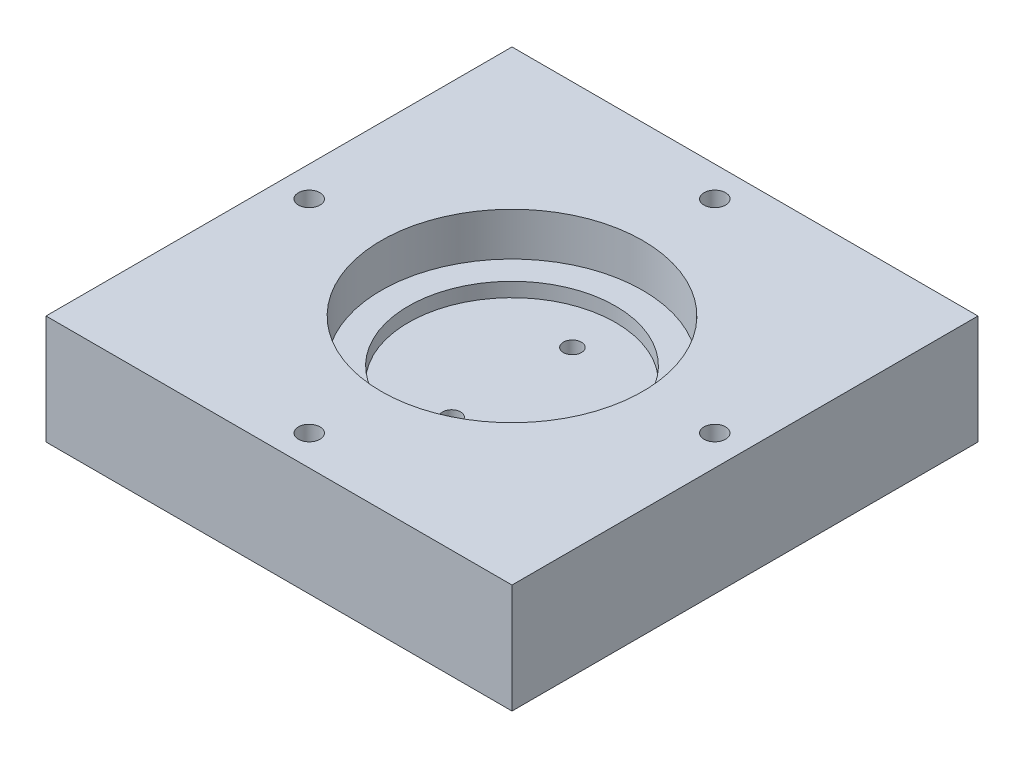
ISO-10303-21;
HEADER;
FILE_DESCRIPTION(('STEP AP214'),'2;1');
FILE_NAME('part.step','',(''),(''),'','','');
FILE_SCHEMA(('AUTOMOTIVE_DESIGN { 1 0 10303 214 1 1 1 1 }'));
ENDSEC;
DATA;
#1=APPLICATION_CONTEXT('core data for automotive mechanical design processes');
#2=APPLICATION_PROTOCOL_DEFINITION('international standard','automotive_design',2000,#1);
#3=PRODUCT_CONTEXT('',#1,'mechanical');
#4=PRODUCT('Part','Part','',(#3));
#5=PRODUCT_RELATED_PRODUCT_CATEGORY('part','',(#4));
#6=PRODUCT_DEFINITION_FORMATION('','',#4);
#7=PRODUCT_DEFINITION_CONTEXT('part definition',#1,'design');
#8=PRODUCT_DEFINITION('design','',#6,#7);
#9=PRODUCT_DEFINITION_SHAPE('','',#8);
#10=(LENGTH_UNIT() NAMED_UNIT(*) SI_UNIT(.MILLI.,.METRE.));
#11=(NAMED_UNIT(*) PLANE_ANGLE_UNIT() SI_UNIT($,.RADIAN.));
#12=(NAMED_UNIT(*) SI_UNIT($,.STERADIAN.) SOLID_ANGLE_UNIT());
#13=UNCERTAINTY_MEASURE_WITH_UNIT(LENGTH_MEASURE(1.E-05),#10,'distance_accuracy_value','');
#14=(GEOMETRIC_REPRESENTATION_CONTEXT(3) GLOBAL_UNCERTAINTY_ASSIGNED_CONTEXT((#13)) GLOBAL_UNIT_ASSIGNED_CONTEXT((#10,
#11,#12)) REPRESENTATION_CONTEXT('',''));
#15=CARTESIAN_POINT('',(0.,0.,0.));
#16=DIRECTION('',(0.,0.,1.));
#17=DIRECTION('',(1.,0.,0.));
#18=AXIS2_PLACEMENT_3D('',#15,#16,#17);
#19=CARTESIAN_POINT('',(0.,0.,0.));
#20=DIRECTION('',(0.,1.,0.));
#21=DIRECTION('',(0.,0.,1.));
#22=AXIS2_PLACEMENT_3D('',#19,#20,#21);
#23=PLANE('',#22);
#24=CARTESIAN_POINT('',(0.,0.,-7.));
#25=DIRECTION('',(0.,1.,0.));
#26=DIRECTION('',(0.,0.,1.));
#27=AXIS2_PLACEMENT_3D('',#24,#25,#26);
#28=CIRCLE('',#27,1.05);
#29=CARTESIAN_POINT('',(0.,0.,-5.95));
#30=VERTEX_POINT('',#29);
#31=EDGE_CURVE('E110',#30,#30,#28,.T.);
#32=ORIENTED_EDGE('',*,*,#31,.T.);
#33=EDGE_LOOP('',(#32));
#34=FACE_BOUND('',#33,.T.);
#35=CARTESIAN_POINT('',(0.,0.,-7.));
#36=DIRECTION('',(0.,-1.,0.));
#37=DIRECTION('',(0.,0.,-1.));
#38=AXIS2_PLACEMENT_3D('',#35,#36,#37);
#39=CIRCLE('',#38,1.875);
#40=CARTESIAN_POINT('',(0.,0.,-8.875));
#41=VERTEX_POINT('',#40);
#42=EDGE_CURVE('E210',#41,#41,#39,.T.);
#43=ORIENTED_EDGE('',*,*,#42,.T.);
#44=EDGE_LOOP('',(#43));
#45=FACE_BOUND('',#44,.T.);
#46=ADVANCED_FACE('F107',(#34,#45),#23,.F.);
#47=CARTESIAN_POINT('',(0.,0.,7.));
#48=DIRECTION('',(0.,1.,0.));
#49=DIRECTION('',(0.,0.,1.));
#50=AXIS2_PLACEMENT_3D('',#47,#48,#49);
#51=CIRCLE('',#50,1.05);
#52=CARTESIAN_POINT('',(0.,0.,8.05));
#53=VERTEX_POINT('',#52);
#54=EDGE_CURVE('E228',#53,#53,#51,.T.);
#55=ORIENTED_EDGE('',*,*,#54,.T.);
#56=EDGE_LOOP('',(#55));
#57=FACE_BOUND('',#56,.T.);
#58=CARTESIAN_POINT('',(0.,0.,7.));
#59=DIRECTION('',(0.,-1.,0.));
#60=DIRECTION('',(0.,0.,-1.));
#61=AXIS2_PLACEMENT_3D('',#58,#59,#60);
#62=CIRCLE('',#61,1.875);
#63=CARTESIAN_POINT('',(0.,0.,5.125));
#64=VERTEX_POINT('',#63);
#65=EDGE_CURVE('E204',#64,#64,#62,.T.);
#66=ORIENTED_EDGE('',*,*,#65,.T.);
#67=EDGE_LOOP('',(#66));
#68=FACE_BOUND('',#67,.T.);
#69=ADVANCED_FACE('F237',(#57,#68),#23,.F.);
#70=CARTESIAN_POINT('',(0.,4.65,0.));
#71=DIRECTION('',(0.,1.,0.));
#72=DIRECTION('',(0.,0.,1.));
#73=AXIS2_PLACEMENT_3D('',#70,#71,#72);
#74=PLANE('',#73);
#75=CARTESIAN_POINT('',(0.,4.65,0.));
#76=DIRECTION('',(0.,1.,0.));
#77=DIRECTION('',(0.,0.,1.));
#78=AXIS2_PLACEMENT_3D('',#75,#76,#77);
#79=CIRCLE('',#78,12.);
#80=CARTESIAN_POINT('',(0.,4.65,12.));
#81=VERTEX_POINT('',#80);
#82=EDGE_CURVE('E225',#81,#81,#79,.T.);
#83=ORIENTED_EDGE('',*,*,#82,.F.);
#84=EDGE_LOOP('',(#83));
#85=FACE_BOUND('',#84,.T.);
#86=CARTESIAN_POINT('',(0.,4.65,0.));
#87=DIRECTION('',(0.,1.,0.));
#88=DIRECTION('',(0.,0.,1.));
#89=AXIS2_PLACEMENT_3D('',#86,#87,#88);
#90=CIRCLE('',#89,15.15);
#91=CARTESIAN_POINT('',(0.,4.65,15.15));
#92=VERTEX_POINT('',#91);
#93=EDGE_CURVE('E216',#92,#92,#90,.T.);
#94=ORIENTED_EDGE('',*,*,#93,.T.);
#95=EDGE_LOOP('',(#94));
#96=FACE_BOUND('',#95,.T.);
#97=ADVANCED_FACE('F262',(#85,#96),#74,.T.);
#98=CARTESIAN_POINT('',(0.,3.,0.));
#99=DIRECTION('',(0.,1.,0.));
#100=DIRECTION('',(0.,0.,1.));
#101=AXIS2_PLACEMENT_3D('',#98,#99,#100);
#102=PLANE('',#101);
#103=CARTESIAN_POINT('',(0.,3.,7.));
#104=DIRECTION('',(0.,1.,0.));
#105=DIRECTION('',(0.,0.,1.));
#106=AXIS2_PLACEMENT_3D('',#103,#104,#105);
#107=CIRCLE('',#106,1.05);
#108=CARTESIAN_POINT('',(0.,3.,8.05));
#109=VERTEX_POINT('',#108);
#110=EDGE_CURVE('E231',#109,#109,#107,.T.);
#111=ORIENTED_EDGE('',*,*,#110,.F.);
#112=EDGE_LOOP('',(#111));
#113=FACE_BOUND('',#112,.T.);
#114=CARTESIAN_POINT('',(0.,3.,-7.));
#115=DIRECTION('',(0.,1.,0.));
#116=DIRECTION('',(0.,0.,1.));
#117=AXIS2_PLACEMENT_3D('',#114,#115,#116);
#118=CIRCLE('',#117,1.05);
#119=CARTESIAN_POINT('',(0.,3.,-5.95));
#120=VERTEX_POINT('',#119);
#121=EDGE_CURVE('E12',#120,#120,#118,.T.);
#122=ORIENTED_EDGE('',*,*,#121,.F.);
#123=EDGE_LOOP('',(#122));
#124=FACE_BOUND('',#123,.T.);
#125=CARTESIAN_POINT('',(0.,3.,0.));
#126=DIRECTION('',(0.,1.,0.));
#127=DIRECTION('',(0.,0.,1.));
#128=AXIS2_PLACEMENT_3D('',#125,#126,#127);
#129=CIRCLE('',#128,12.);
#130=CARTESIAN_POINT('',(0.,3.,12.));
#131=VERTEX_POINT('',#130);
#132=EDGE_CURVE('E222',#131,#131,#129,.T.);
#133=ORIENTED_EDGE('',*,*,#132,.T.);
#134=EDGE_LOOP('',(#133));
#135=FACE_BOUND('',#134,.T.);
#136=ADVANCED_FACE('F253',(#113,#124,#135),#102,.T.);
#137=CARTESIAN_POINT('',(0.,3.,-7.));
#138=DIRECTION('',(0.,-1.,0.));
#139=DIRECTION('',(0.,0.,-1.));
#140=AXIS2_PLACEMENT_3D('',#137,#138,#139);
#141=CYLINDRICAL_SURFACE('',#140,1.05);
#142=ORIENTED_EDGE('',*,*,#121,.T.);
#143=EDGE_LOOP('',(#142));
#144=FACE_BOUND('',#143,.T.);
#145=ORIENTED_EDGE('',*,*,#31,.F.);
#146=EDGE_LOOP('',(#145));
#147=FACE_BOUND('',#146,.T.);
#148=ADVANCED_FACE('F243',(#144,#147),#141,.F.);
#149=CARTESIAN_POINT('',(0.,3.,7.));
#150=DIRECTION('',(0.,-1.,0.));
#151=DIRECTION('',(0.,0.,-1.));
#152=AXIS2_PLACEMENT_3D('',#149,#150,#151);
#153=CYLINDRICAL_SURFACE('',#152,1.05);
#154=ORIENTED_EDGE('',*,*,#110,.T.);
#155=EDGE_LOOP('',(#154));
#156=FACE_BOUND('',#155,.T.);
#157=ORIENTED_EDGE('',*,*,#54,.F.);
#158=EDGE_LOOP('',(#157));
#159=FACE_BOUND('',#158,.T.);
#160=ADVANCED_FACE('F240',(#156,#159),#153,.F.);
#161=CARTESIAN_POINT('',(0.,4.65,0.));
#162=DIRECTION('',(0.,-1.,0.));
#163=DIRECTION('',(0.,0.,-1.));
#164=AXIS2_PLACEMENT_3D('',#161,#162,#163);
#165=CYLINDRICAL_SURFACE('',#164,12.);
#166=ORIENTED_EDGE('',*,*,#82,.T.);
#167=EDGE_LOOP('',(#166));
#168=FACE_BOUND('',#167,.T.);
#169=ORIENTED_EDGE('',*,*,#132,.F.);
#170=EDGE_LOOP('',(#169));
#171=FACE_BOUND('',#170,.T.);
#172=ADVANCED_FACE('F242',(#168,#171),#165,.F.);
#173=CARTESIAN_POINT('',(0.,9.65,0.));
#174=DIRECTION('',(0.,1.,0.));
#175=DIRECTION('',(0.,0.,1.));
#176=AXIS2_PLACEMENT_3D('',#173,#174,#175);
#177=PLANE('',#176);
#178=CARTESIAN_POINT('',(-23.5,9.65,0.));
#179=DIRECTION('',(0.,1.,0.));
#180=DIRECTION('',(1.,0.,0.));
#181=AXIS2_PLACEMENT_3D('',#178,#179,#180);
#182=CIRCLE('',#181,1.25);
#183=CARTESIAN_POINT('',(-22.25,9.65,0.));
#184=VERTEX_POINT('',#183);
#185=EDGE_CURVE('E187',#184,#184,#182,.T.);
#186=ORIENTED_EDGE('',*,*,#185,.F.);
#187=EDGE_LOOP('',(#186));
#188=FACE_BOUND('',#187,.T.);
#189=CARTESIAN_POINT('',(0.,9.65,23.5));
#190=DIRECTION('',(0.,1.,0.));
#191=DIRECTION('',(0.,0.,-1.));
#192=AXIS2_PLACEMENT_3D('',#189,#190,#191);
#193=CIRCLE('',#192,1.25);
#194=CARTESIAN_POINT('',(0.,9.65,22.25));
#195=VERTEX_POINT('',#194);
#196=EDGE_CURVE('E193',#195,#195,#193,.T.);
#197=ORIENTED_EDGE('',*,*,#196,.F.);
#198=EDGE_LOOP('',(#197));
#199=FACE_BOUND('',#198,.T.);
#200=CARTESIAN_POINT('',(23.5,9.65,-2.46149434388441E-13));
#201=DIRECTION('',(0.,1.,0.));
#202=DIRECTION('',(-1.,0.,0.));
#203=AXIS2_PLACEMENT_3D('',#200,#201,#202);
#204=CIRCLE('',#203,1.25);
#205=CARTESIAN_POINT('',(22.25,9.65,-2.33056379367779E-13));
#206=VERTEX_POINT('',#205);
#207=EDGE_CURVE('E181',#206,#206,#204,.T.);
#208=ORIENTED_EDGE('',*,*,#207,.F.);
#209=EDGE_LOOP('',(#208));
#210=FACE_BOUND('',#209,.T.);
#211=CARTESIAN_POINT('',(0.,9.65,-23.5));
#212=DIRECTION('',(0.,1.,0.));
#213=DIRECTION('',(0.,0.,1.));
#214=AXIS2_PLACEMENT_3D('',#211,#212,#213);
#215=CIRCLE('',#214,1.25);
#216=CARTESIAN_POINT('',(0.,9.65,-22.25));
#217=VERTEX_POINT('',#216);
#218=EDGE_CURVE('E186',#217,#217,#215,.T.);
#219=ORIENTED_EDGE('',*,*,#218,.F.);
#220=EDGE_LOOP('',(#219));
#221=FACE_BOUND('',#220,.T.);
#222=DIRECTION('',(0.,0.,1.));
#223=VECTOR('',#222,1.);
#224=CARTESIAN_POINT('',(-27.,9.65,0.));
#225=LINE('',#224,#223);
#226=CARTESIAN_POINT('',(-27.,9.65,-27.));
#227=VERTEX_POINT('',#226);
#228=CARTESIAN_POINT('',(-27.,9.65,27.));
#229=VERTEX_POINT('',#228);
#230=EDGE_CURVE('E179',#227,#229,#225,.T.);
#231=ORIENTED_EDGE('',*,*,#230,.T.);
#232=DIRECTION('',(1.,0.,0.));
#233=VECTOR('',#232,1.);
#234=CARTESIAN_POINT('',(0.,9.65,27.));
#235=LINE('',#234,#233);
#236=CARTESIAN_POINT('',(27.,9.65,27.));
#237=VERTEX_POINT('',#236);
#238=EDGE_CURVE('E166',#229,#237,#235,.T.);
#239=ORIENTED_EDGE('',*,*,#238,.T.);
#240=DIRECTION('',(0.,0.,1.));
#241=VECTOR('',#240,1.);
#242=CARTESIAN_POINT('',(27.,9.65,0.));
#243=LINE('',#242,#241);
#244=CARTESIAN_POINT('',(27.,9.65,-27.));
#245=VERTEX_POINT('',#244);
#246=EDGE_CURVE('E173',#245,#237,#243,.T.);
#247=ORIENTED_EDGE('',*,*,#246,.F.);
#248=DIRECTION('',(1.,0.,0.));
#249=VECTOR('',#248,1.);
#250=CARTESIAN_POINT('',(0.,9.65,-27.));
#251=LINE('',#250,#249);
#252=EDGE_CURVE('E177',#227,#245,#251,.T.);
#253=ORIENTED_EDGE('',*,*,#252,.F.);
#254=EDGE_LOOP('',(#231,#239,#247,#253));
#255=FACE_BOUND('',#254,.T.);
#256=CARTESIAN_POINT('',(0.,9.65,0.));
#257=DIRECTION('',(0.,1.,0.));
#258=DIRECTION('',(0.,0.,1.));
#259=AXIS2_PLACEMENT_3D('',#256,#257,#258);
#260=CIRCLE('',#259,15.15);
#261=CARTESIAN_POINT('',(0.,9.65,15.15));
#262=VERTEX_POINT('',#261);
#263=EDGE_CURVE('E219',#262,#262,#260,.T.);
#264=ORIENTED_EDGE('',*,*,#263,.F.);
#265=EDGE_LOOP('',(#264));
#266=FACE_BOUND('',#265,.T.);
#267=ADVANCED_FACE('F250',(#188,#199,#210,#221,#255,#266),#177,.T.);
#268=CARTESIAN_POINT('',(0.,9.65,0.));
#269=DIRECTION('',(0.,-1.,0.));
#270=DIRECTION('',(0.,0.,-1.));
#271=AXIS2_PLACEMENT_3D('',#268,#269,#270);
#272=CYLINDRICAL_SURFACE('',#271,15.15);
#273=ORIENTED_EDGE('',*,*,#263,.T.);
#274=EDGE_LOOP('',(#273));
#275=FACE_BOUND('',#274,.T.);
#276=ORIENTED_EDGE('',*,*,#93,.F.);
#277=EDGE_LOOP('',(#276));
#278=FACE_BOUND('',#277,.T.);
#279=ADVANCED_FACE('F281',(#275,#278),#272,.F.);
#280=CARTESIAN_POINT('',(0.,-3.,0.));
#281=DIRECTION('',(0.,-1.,0.));
#282=DIRECTION('',(0.,0.,-1.));
#283=AXIS2_PLACEMENT_3D('',#280,#281,#282);
#284=PLANE('',#283);
#285=CARTESIAN_POINT('',(-23.5,-3.,0.));
#286=DIRECTION('',(0.,1.,0.));
#287=DIRECTION('',(1.,0.,0.));
#288=AXIS2_PLACEMENT_3D('',#285,#286,#287);
#289=CIRCLE('',#288,1.25);
#290=CARTESIAN_POINT('',(-22.25,-3.,0.));
#291=VERTEX_POINT('',#290);
#292=EDGE_CURVE('E183',#291,#291,#289,.T.);
#293=ORIENTED_EDGE('',*,*,#292,.T.);
#294=EDGE_LOOP('',(#293));
#295=FACE_BOUND('',#294,.T.);
#296=CARTESIAN_POINT('',(0.,-3.,23.5));
#297=DIRECTION('',(0.,1.,0.));
#298=DIRECTION('',(0.,0.,-1.));
#299=AXIS2_PLACEMENT_3D('',#296,#297,#298);
#300=CIRCLE('',#299,1.25);
#301=CARTESIAN_POINT('',(0.,-3.,22.25));
#302=VERTEX_POINT('',#301);
#303=EDGE_CURVE('E190',#302,#302,#300,.T.);
#304=ORIENTED_EDGE('',*,*,#303,.T.);
#305=EDGE_LOOP('',(#304));
#306=FACE_BOUND('',#305,.T.);
#307=CARTESIAN_POINT('',(23.5,-3.,-2.46149434388441E-13));
#308=DIRECTION('',(0.,1.,0.));
#309=DIRECTION('',(-1.,0.,0.));
#310=AXIS2_PLACEMENT_3D('',#307,#308,#309);
#311=CIRCLE('',#310,1.25);
#312=CARTESIAN_POINT('',(22.25,-3.,-2.33056379367779E-13));
#313=VERTEX_POINT('',#312);
#314=EDGE_CURVE('E196',#313,#313,#311,.T.);
#315=ORIENTED_EDGE('',*,*,#314,.T.);
#316=EDGE_LOOP('',(#315));
#317=FACE_BOUND('',#316,.T.);
#318=CARTESIAN_POINT('',(0.,-3.,-23.5));
#319=DIRECTION('',(0.,1.,0.));
#320=DIRECTION('',(0.,0.,1.));
#321=AXIS2_PLACEMENT_3D('',#318,#319,#320);
#322=CIRCLE('',#321,1.25);
#323=CARTESIAN_POINT('',(0.,-3.,-22.25));
#324=VERTEX_POINT('',#323);
#325=EDGE_CURVE('E201',#324,#324,#322,.T.);
#326=ORIENTED_EDGE('',*,*,#325,.T.);
#327=EDGE_LOOP('',(#326));
#328=FACE_BOUND('',#327,.T.);
#329=CARTESIAN_POINT('',(0.,-3.,-7.));
#330=DIRECTION('',(0.,-1.,0.));
#331=DIRECTION('',(0.,0.,-1.));
#332=AXIS2_PLACEMENT_3D('',#329,#330,#331);
#333=CIRCLE('',#332,1.875);
#334=CARTESIAN_POINT('',(0.,-3.,-8.875));
#335=VERTEX_POINT('',#334);
#336=EDGE_CURVE('E213',#335,#335,#333,.T.);
#337=ORIENTED_EDGE('',*,*,#336,.F.);
#338=EDGE_LOOP('',(#337));
#339=FACE_BOUND('',#338,.T.);
#340=DIRECTION('',(1.,0.,0.));
#341=VECTOR('',#340,1.);
#342=CARTESIAN_POINT('',(0.,-3.,-27.));
#343=LINE('',#342,#341);
#344=CARTESIAN_POINT('',(-27.,-3.,-27.));
#345=VERTEX_POINT('',#344);
#346=CARTESIAN_POINT('',(27.,-3.,-27.));
#347=VERTEX_POINT('',#346);
#348=EDGE_CURVE('E149',#345,#347,#343,.T.);
#349=ORIENTED_EDGE('',*,*,#348,.T.);
#350=DIRECTION('',(0.,0.,1.));
#351=VECTOR('',#350,1.);
#352=CARTESIAN_POINT('',(27.,-3.,0.));
#353=LINE('',#352,#351);
#354=CARTESIAN_POINT('',(27.,-3.,27.));
#355=VERTEX_POINT('',#354);
#356=EDGE_CURVE('E150',#347,#355,#353,.T.);
#357=ORIENTED_EDGE('',*,*,#356,.T.);
#358=DIRECTION('',(1.,0.,0.));
#359=VECTOR('',#358,1.);
#360=CARTESIAN_POINT('',(0.,-3.,27.));
#361=LINE('',#360,#359);
#362=CARTESIAN_POINT('',(-27.,-3.,27.));
#363=VERTEX_POINT('',#362);
#364=EDGE_CURVE('E153',#363,#355,#361,.T.);
#365=ORIENTED_EDGE('',*,*,#364,.F.);
#366=DIRECTION('',(0.,0.,1.));
#367=VECTOR('',#366,1.);
#368=CARTESIAN_POINT('',(-27.,-3.,0.));
#369=LINE('',#368,#367);
#370=EDGE_CURVE('E143',#345,#363,#369,.T.);
#371=ORIENTED_EDGE('',*,*,#370,.F.);
#372=EDGE_LOOP('',(#349,#357,#365,#371));
#373=FACE_BOUND('',#372,.T.);
#374=CARTESIAN_POINT('',(0.,-3.,7.));
#375=DIRECTION('',(0.,-1.,0.));
#376=DIRECTION('',(0.,0.,-1.));
#377=AXIS2_PLACEMENT_3D('',#374,#375,#376);
#378=CIRCLE('',#377,1.875);
#379=CARTESIAN_POINT('',(0.,-3.,5.125));
#380=VERTEX_POINT('',#379);
#381=EDGE_CURVE('E207',#380,#380,#378,.T.);
#382=ORIENTED_EDGE('',*,*,#381,.F.);
#383=EDGE_LOOP('',(#382));
#384=FACE_BOUND('',#383,.T.);
#385=ADVANCED_FACE('F154',(#295,#306,#317,#328,#339,#373,#384),#284,.T.);
#386=CARTESIAN_POINT('',(0.,-3.,-7.));
#387=DIRECTION('',(0.,1.,0.));
#388=DIRECTION('',(0.,0.,1.));
#389=AXIS2_PLACEMENT_3D('',#386,#387,#388);
#390=CYLINDRICAL_SURFACE('',#389,1.875);
#391=ORIENTED_EDGE('',*,*,#336,.T.);
#392=EDGE_LOOP('',(#391));
#393=FACE_BOUND('',#392,.T.);
#394=ORIENTED_EDGE('',*,*,#42,.F.);
#395=EDGE_LOOP('',(#394));
#396=FACE_BOUND('',#395,.T.);
#397=ADVANCED_FACE('F268',(#393,#396),#390,.F.);
#398=CARTESIAN_POINT('',(0.,-3.,7.));
#399=DIRECTION('',(0.,1.,0.));
#400=DIRECTION('',(0.,0.,1.));
#401=AXIS2_PLACEMENT_3D('',#398,#399,#400);
#402=CYLINDRICAL_SURFACE('',#401,1.875);
#403=ORIENTED_EDGE('',*,*,#381,.T.);
#404=EDGE_LOOP('',(#403));
#405=FACE_BOUND('',#404,.T.);
#406=ORIENTED_EDGE('',*,*,#65,.F.);
#407=EDGE_LOOP('',(#406));
#408=FACE_BOUND('',#407,.T.);
#409=ADVANCED_FACE('F270',(#405,#408),#402,.F.);
#410=CARTESIAN_POINT('',(0.,-3.,-23.5));
#411=DIRECTION('',(0.,1.,0.));
#412=DIRECTION('',(0.,0.,1.));
#413=AXIS2_PLACEMENT_3D('',#410,#411,#412);
#414=CYLINDRICAL_SURFACE('',#413,1.25);
#415=ORIENTED_EDGE('',*,*,#325,.F.);
#416=EDGE_LOOP('',(#415));
#417=FACE_BOUND('',#416,.T.);
#418=ORIENTED_EDGE('',*,*,#218,.T.);
#419=EDGE_LOOP('',(#418));
#420=FACE_BOUND('',#419,.T.);
#421=ADVANCED_FACE('F277',(#417,#420),#414,.F.);
#422=CARTESIAN_POINT('',(23.5,-3.,-2.46149434388441E-13));
#423=DIRECTION('',(0.,1.,0.));
#424=DIRECTION('',(0.,0.,1.));
#425=AXIS2_PLACEMENT_3D('',#422,#423,#424);
#426=CYLINDRICAL_SURFACE('',#425,1.25);
#427=ORIENTED_EDGE('',*,*,#314,.F.);
#428=EDGE_LOOP('',(#427));
#429=FACE_BOUND('',#428,.T.);
#430=ORIENTED_EDGE('',*,*,#207,.T.);
#431=EDGE_LOOP('',(#430));
#432=FACE_BOUND('',#431,.T.);
#433=ADVANCED_FACE('F377',(#429,#432),#426,.F.);
#434=CARTESIAN_POINT('',(0.,-3.,23.5));
#435=DIRECTION('',(0.,1.,0.));
#436=DIRECTION('',(0.,0.,1.));
#437=AXIS2_PLACEMENT_3D('',#434,#435,#436);
#438=CYLINDRICAL_SURFACE('',#437,1.25);
#439=ORIENTED_EDGE('',*,*,#303,.F.);
#440=EDGE_LOOP('',(#439));
#441=FACE_BOUND('',#440,.T.);
#442=ORIENTED_EDGE('',*,*,#196,.T.);
#443=EDGE_LOOP('',(#442));
#444=FACE_BOUND('',#443,.T.);
#445=ADVANCED_FACE('F385',(#441,#444),#438,.F.);
#446=CARTESIAN_POINT('',(-23.5,-3.,0.));
#447=DIRECTION('',(0.,1.,0.));
#448=DIRECTION('',(0.,0.,1.));
#449=AXIS2_PLACEMENT_3D('',#446,#447,#448);
#450=CYLINDRICAL_SURFACE('',#449,1.25);
#451=ORIENTED_EDGE('',*,*,#292,.F.);
#452=EDGE_LOOP('',(#451));
#453=FACE_BOUND('',#452,.T.);
#454=ORIENTED_EDGE('',*,*,#185,.T.);
#455=EDGE_LOOP('',(#454));
#456=FACE_BOUND('',#455,.T.);
#457=ADVANCED_FACE('F394',(#453,#456),#450,.F.);
#458=CARTESIAN_POINT('',(0.,47.8337661840736,-27.));
#459=DIRECTION('',(0.,0.,-1.));
#460=DIRECTION('',(-1.,0.,0.));
#461=AXIS2_PLACEMENT_3D('',#458,#459,#460);
#462=PLANE('',#461);
#463=DIRECTION('',(0.,-1.,0.));
#464=VECTOR('',#463,1.);
#465=CARTESIAN_POINT('',(-27.,47.8337661840736,-27.));
#466=LINE('',#465,#464);
#467=EDGE_CURVE('E121',#227,#345,#466,.T.);
#468=ORIENTED_EDGE('',*,*,#467,.F.);
#469=ORIENTED_EDGE('',*,*,#252,.T.);
#470=DIRECTION('',(0.,-1.,0.));
#471=VECTOR('',#470,1.);
#472=CARTESIAN_POINT('',(27.,47.8337661840736,-27.));
#473=LINE('',#472,#471);
#474=EDGE_CURVE('E160',#245,#347,#473,.T.);
#475=ORIENTED_EDGE('',*,*,#474,.T.);
#476=ORIENTED_EDGE('',*,*,#348,.F.);
#477=EDGE_LOOP('',(#468,#469,#475,#476));
#478=FACE_BOUND('',#477,.T.);
#479=ADVANCED_FACE('F403',(#478),#462,.T.);
#480=CARTESIAN_POINT('',(-27.,47.8337661840736,0.));
#481=DIRECTION('',(1.,0.,0.));
#482=DIRECTION('',(0.,0.,-1.));
#483=AXIS2_PLACEMENT_3D('',#480,#481,#482);
#484=PLANE('',#483);
#485=ORIENTED_EDGE('',*,*,#230,.F.);
#486=ORIENTED_EDGE('',*,*,#467,.T.);
#487=ORIENTED_EDGE('',*,*,#370,.T.);
#488=DIRECTION('',(0.,-1.,0.));
#489=VECTOR('',#488,1.);
#490=CARTESIAN_POINT('',(-27.,47.8337661840736,27.));
#491=LINE('',#490,#489);
#492=EDGE_CURVE('E147',#229,#363,#491,.T.);
#493=ORIENTED_EDGE('',*,*,#492,.F.);
#494=EDGE_LOOP('',(#485,#486,#487,#493));
#495=FACE_BOUND('',#494,.T.);
#496=ADVANCED_FACE('F145',(#495),#484,.F.);
#497=CARTESIAN_POINT('',(27.,47.8337661840736,0.));
#498=DIRECTION('',(1.,0.,0.));
#499=DIRECTION('',(0.,0.,-1.));
#500=AXIS2_PLACEMENT_3D('',#497,#498,#499);
#501=PLANE('',#500);
#502=ORIENTED_EDGE('',*,*,#474,.F.);
#503=ORIENTED_EDGE('',*,*,#246,.T.);
#504=DIRECTION('',(0.,-1.,0.));
#505=VECTOR('',#504,1.);
#506=CARTESIAN_POINT('',(27.,47.8337661840736,27.));
#507=LINE('',#506,#505);
#508=EDGE_CURVE('E161',#237,#355,#507,.T.);
#509=ORIENTED_EDGE('',*,*,#508,.T.);
#510=ORIENTED_EDGE('',*,*,#356,.F.);
#511=EDGE_LOOP('',(#502,#503,#509,#510));
#512=FACE_BOUND('',#511,.T.);
#513=ADVANCED_FACE('F437',(#512),#501,.T.);
#514=CARTESIAN_POINT('',(0.,47.8337661840736,27.));
#515=DIRECTION('',(0.,0.,-1.));
#516=DIRECTION('',(-1.,0.,0.));
#517=AXIS2_PLACEMENT_3D('',#514,#515,#516);
#518=PLANE('',#517);
#519=ORIENTED_EDGE('',*,*,#238,.F.);
#520=ORIENTED_EDGE('',*,*,#492,.T.);
#521=ORIENTED_EDGE('',*,*,#364,.T.);
#522=ORIENTED_EDGE('',*,*,#508,.F.);
#523=EDGE_LOOP('',(#519,#520,#521,#522));
#524=FACE_BOUND('',#523,.T.);
#525=ADVANCED_FACE('F164',(#524),#518,.F.);
#526=CLOSED_SHELL('',(#46,#69,#97,#136,#148,#160,#172,#267,#279,#385,#397,#409,#421,#433,#445,
#457,#479,#496,#513,#525));
#527=MANIFOLD_SOLID_BREP('B2',#526);
#528=ADVANCED_BREP_SHAPE_REPRESENTATION('',(#18,#527),#14);
#529=SHAPE_DEFINITION_REPRESENTATION(#9,#528);
ENDSEC;
END-ISO-10303-21;
